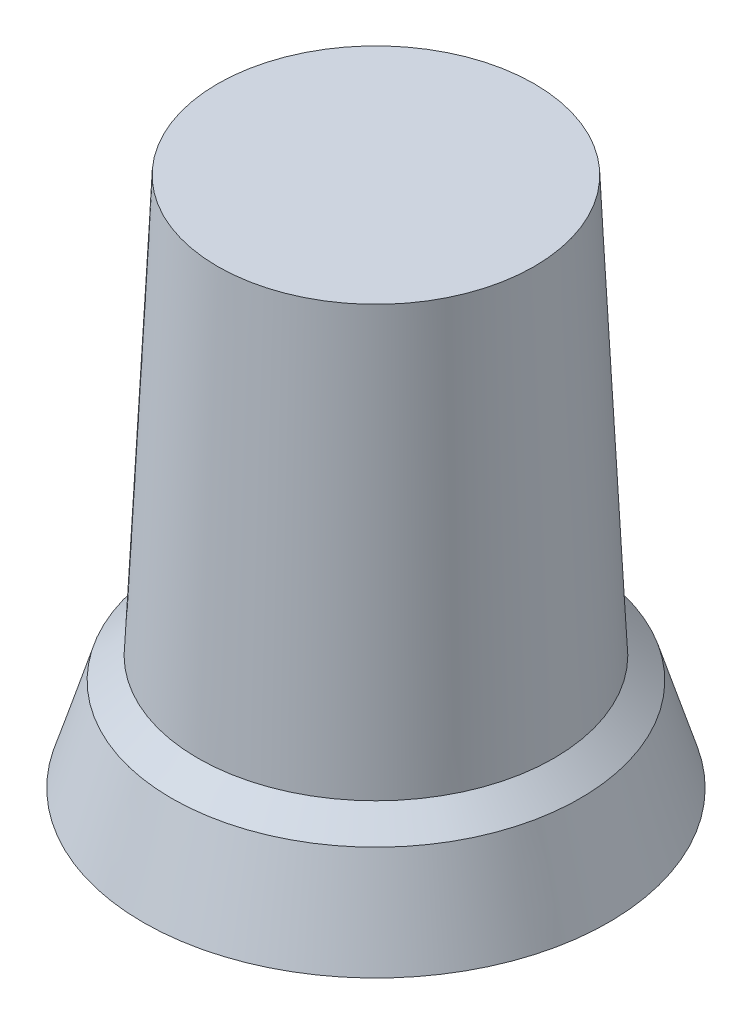
ISO-10303-21;
HEADER;
FILE_DESCRIPTION(('STEP AP214'),'2;1');
FILE_NAME('part.step','',(''),(''),'','','');
FILE_SCHEMA(('AUTOMOTIVE_DESIGN { 1 0 10303 214 1 1 1 1 }'));
ENDSEC;
DATA;
#1=APPLICATION_CONTEXT('core data for automotive mechanical design processes');
#2=APPLICATION_PROTOCOL_DEFINITION('international standard','automotive_design',2000,#1);
#3=PRODUCT_CONTEXT('',#1,'mechanical');
#4=PRODUCT('Part','Part','',(#3));
#5=PRODUCT_RELATED_PRODUCT_CATEGORY('part','',(#4));
#6=PRODUCT_DEFINITION_FORMATION('','',#4);
#7=PRODUCT_DEFINITION_CONTEXT('part definition',#1,'design');
#8=PRODUCT_DEFINITION('design','',#6,#7);
#9=PRODUCT_DEFINITION_SHAPE('','',#8);
#10=(LENGTH_UNIT() NAMED_UNIT(*) SI_UNIT(.MILLI.,.METRE.));
#11=(NAMED_UNIT(*) PLANE_ANGLE_UNIT() SI_UNIT($,.RADIAN.));
#12=(NAMED_UNIT(*) SI_UNIT($,.STERADIAN.) SOLID_ANGLE_UNIT());
#13=UNCERTAINTY_MEASURE_WITH_UNIT(LENGTH_MEASURE(1.E-05),#10,'distance_accuracy_value','');
#14=(GEOMETRIC_REPRESENTATION_CONTEXT(3) GLOBAL_UNCERTAINTY_ASSIGNED_CONTEXT((#13)) GLOBAL_UNIT_ASSIGNED_CONTEXT((#10,
#11,#12)) REPRESENTATION_CONTEXT('',''));
#15=CARTESIAN_POINT('',(0.,0.,0.));
#16=DIRECTION('',(0.,0.,1.));
#17=DIRECTION('',(1.,0.,0.));
#18=AXIS2_PLACEMENT_3D('',#15,#16,#17);
#19=CARTESIAN_POINT('',(0.,-8.38727725909835,0.));
#20=DIRECTION('',(0.,1.,0.));
#21=DIRECTION('',(0.,0.,1.));
#22=AXIS2_PLACEMENT_3D('',#19,#20,#21);
#23=CONICAL_SURFACE('',#22,6.83072698757219,1.27340551253659);
#24=CARTESIAN_POINT('',(0.,-8.18215867184745,0.));
#25=DIRECTION('',(0.,1.,0.));
#26=DIRECTION('',(0.,0.,1.));
#27=AXIS2_PLACEMENT_3D('',#24,#25,#26);
#28=CIRCLE('',#27,7.5);
#29=CARTESIAN_POINT('',(0.,-8.18215867184745,7.5));
#30=VERTEX_POINT('',#29);
#31=EDGE_CURVE('E76',#30,#30,#28,.T.);
#32=ORIENTED_EDGE('',*,*,#31,.F.);
#33=EDGE_LOOP('',(#32));
#34=FACE_BOUND('',#33,.T.);
#35=CARTESIAN_POINT('',(0.,-8.38727725909835,0.));
#36=DIRECTION('',(0.,1.,0.));
#37=DIRECTION('',(0.,0.,1.));
#38=AXIS2_PLACEMENT_3D('',#35,#36,#37);
#39=CIRCLE('',#38,6.83072698757219);
#40=CARTESIAN_POINT('',(0.,-8.38727725909835,6.83072698757219));
#41=VERTEX_POINT('',#40);
#42=EDGE_CURVE('E10',#41,#41,#39,.T.);
#43=ORIENTED_EDGE('',*,*,#42,.T.);
#44=EDGE_LOOP('',(#43));
#45=FACE_BOUND('',#44,.T.);
#46=ADVANCED_FACE('F41',(#34,#45),#23,.T.);
#47=CARTESIAN_POINT('',(0.,-5.58703224478928,0.));
#48=DIRECTION('',(0.,-1.,0.));
#49=DIRECTION('',(0.,0.,-1.));
#50=AXIS2_PLACEMENT_3D('',#47,#48,#49);
#51=CONICAL_SURFACE('',#50,5.97250875581073,0.297390814258308);
#52=ORIENTED_EDGE('',*,*,#42,.F.);
#53=EDGE_LOOP('',(#52));
#54=FACE_BOUND('',#53,.T.);
#55=CARTESIAN_POINT('',(0.,-5.58703224478928,0.));
#56=DIRECTION('',(0.,1.,0.));
#57=DIRECTION('',(0.,0.,1.));
#58=AXIS2_PLACEMENT_3D('',#55,#56,#57);
#59=CIRCLE('',#58,5.97250875581073);
#60=CARTESIAN_POINT('',(0.,-5.58703224478928,5.97250875581073));
#61=VERTEX_POINT('',#60);
#62=EDGE_CURVE('E48',#61,#61,#59,.T.);
#63=ORIENTED_EDGE('',*,*,#62,.T.);
#64=EDGE_LOOP('',(#63));
#65=FACE_BOUND('',#64,.T.);
#66=ADVANCED_FACE('F84',(#54,#65),#51,.F.);
#67=CARTESIAN_POINT('',(0.,-4.82347792026983,0.));
#68=DIRECTION('',(0.,-1.,0.));
#69=DIRECTION('',(0.,0.,-1.));
#70=AXIS2_PLACEMENT_3D('',#67,#68,#69);
#71=CONICAL_SURFACE('',#70,5.05357518031395,0.877487842459204);
#72=ORIENTED_EDGE('',*,*,#62,.F.);
#73=EDGE_LOOP('',(#72));
#74=FACE_BOUND('',#73,.T.);
#75=CARTESIAN_POINT('',(0.,-4.82347792026983,0.));
#76=DIRECTION('',(0.,1.,0.));
#77=DIRECTION('',(0.,0.,1.));
#78=AXIS2_PLACEMENT_3D('',#75,#76,#77);
#79=CIRCLE('',#78,5.05357518031395);
#80=CARTESIAN_POINT('',(0.,-4.82347792026983,5.05357518031395));
#81=VERTEX_POINT('',#80);
#82=EDGE_CURVE('E53',#81,#81,#79,.T.);
#83=ORIENTED_EDGE('',*,*,#82,.T.);
#84=EDGE_LOOP('',(#83));
#85=FACE_BOUND('',#84,.T.);
#86=ADVANCED_FACE('F88',(#74,#85),#71,.F.);
#87=CARTESIAN_POINT('',(0.,8.21784132815255,0.));
#88=DIRECTION('',(0.,-1.,0.));
#89=DIRECTION('',(0.,0.,-1.));
#90=AXIS2_PLACEMENT_3D('',#87,#88,#89);
#91=CONICAL_SURFACE('',#90,4.43254109717949,0.0475845477712229);
#92=ORIENTED_EDGE('',*,*,#82,.F.);
#93=EDGE_LOOP('',(#92));
#94=FACE_BOUND('',#93,.T.);
#95=CARTESIAN_POINT('',(0.,8.21784132815255,0.));
#96=DIRECTION('',(0.,1.,0.));
#97=DIRECTION('',(0.,0.,1.));
#98=AXIS2_PLACEMENT_3D('',#95,#96,#97);
#99=CIRCLE('',#98,4.43254109717949);
#100=CARTESIAN_POINT('',(0.,8.21784132815255,4.43254109717949));
#101=VERTEX_POINT('',#100);
#102=EDGE_CURVE('E58',#101,#101,#99,.T.);
#103=ORIENTED_EDGE('',*,*,#102,.T.);
#104=EDGE_LOOP('',(#103));
#105=FACE_BOUND('',#104,.T.);
#106=ADVANCED_FACE('F93',(#94,#105),#91,.F.);
#107=CARTESIAN_POINT('',(4.43254109717949,8.21784132815255,0.));
#108=DIRECTION('',(0.,1.,0.));
#109=DIRECTION('',(0.,0.,1.));
#110=AXIS2_PLACEMENT_3D('',#107,#108,#109);
#111=PLANE('',#110);
#112=ORIENTED_EDGE('',*,*,#102,.F.);
#113=EDGE_LOOP('',(#112));
#114=FACE_BOUND('',#113,.T.);
#115=ADVANCED_FACE('F99',(#114),#111,.F.);
#116=CARTESIAN_POINT('',(5.1,8.91784132815255,0.));
#117=DIRECTION('',(0.,-1.,0.));
#118=DIRECTION('',(0.,0.,-1.));
#119=AXIS2_PLACEMENT_3D('',#116,#117,#118);
#120=PLANE('',#119);
#121=CARTESIAN_POINT('',(0.,8.91784132815256,0.));
#122=DIRECTION('',(0.,1.,0.));
#123=DIRECTION('',(0.,0.,1.));
#124=AXIS2_PLACEMENT_3D('',#121,#122,#123);
#125=CIRCLE('',#124,5.1);
#126=CARTESIAN_POINT('',(0.,8.91784132815256,5.1));
#127=VERTEX_POINT('',#126);
#128=EDGE_CURVE('E64',#127,#127,#125,.T.);
#129=ORIENTED_EDGE('',*,*,#128,.T.);
#130=EDGE_LOOP('',(#129));
#131=FACE_BOUND('',#130,.T.);
#132=ADVANCED_FACE('F103',(#131),#120,.F.);
#133=CARTESIAN_POINT('',(0.,-4.48215867184745,0.));
#134=DIRECTION('',(0.,-1.,0.));
#135=DIRECTION('',(0.,0.,-1.));
#136=AXIS2_PLACEMENT_3D('',#133,#134,#135);
#137=CONICAL_SURFACE('',#136,5.73811463821104,0.0475845477712228);
#138=ORIENTED_EDGE('',*,*,#128,.F.);
#139=EDGE_LOOP('',(#138));
#140=FACE_BOUND('',#139,.T.);
#141=CARTESIAN_POINT('',(0.,-4.48215867184745,0.));
#142=DIRECTION('',(0.,1.,0.));
#143=DIRECTION('',(0.,0.,1.));
#144=AXIS2_PLACEMENT_3D('',#141,#142,#143);
#145=CIRCLE('',#144,5.73811463821104);
#146=CARTESIAN_POINT('',(0.,-4.48215867184745,5.73811463821104));
#147=VERTEX_POINT('',#146);
#148=EDGE_CURVE('E68',#147,#147,#145,.T.);
#149=ORIENTED_EDGE('',*,*,#148,.T.);
#150=EDGE_LOOP('',(#149));
#151=FACE_BOUND('',#150,.T.);
#152=ADVANCED_FACE('F107',(#140,#151),#137,.T.);
#153=CARTESIAN_POINT('',(0.,-5.18215867184744,0.));
#154=DIRECTION('',(0.,-1.,0.));
#155=DIRECTION('',(0.,0.,-1.));
#156=AXIS2_PLACEMENT_3D('',#153,#154,#155);
#157=CONICAL_SURFACE('',#156,6.58056092158791,0.877487842459207);
#158=ORIENTED_EDGE('',*,*,#148,.F.);
#159=EDGE_LOOP('',(#158));
#160=FACE_BOUND('',#159,.T.);
#161=CARTESIAN_POINT('',(0.,-5.18215867184744,0.));
#162=DIRECTION('',(0.,1.,0.));
#163=DIRECTION('',(0.,0.,1.));
#164=AXIS2_PLACEMENT_3D('',#161,#162,#163);
#165=CIRCLE('',#164,6.58056092158791);
#166=CARTESIAN_POINT('',(0.,-5.18215867184744,6.58056092158791));
#167=VERTEX_POINT('',#166);
#168=EDGE_CURVE('E72',#167,#167,#165,.T.);
#169=ORIENTED_EDGE('',*,*,#168,.T.);
#170=EDGE_LOOP('',(#169));
#171=FACE_BOUND('',#170,.T.);
#172=ADVANCED_FACE('F111',(#160,#171),#157,.T.);
#173=CARTESIAN_POINT('',(0.,-8.18215867184745,0.));
#174=DIRECTION('',(0.,-1.,0.));
#175=DIRECTION('',(0.,0.,-1.));
#176=AXIS2_PLACEMENT_3D('',#173,#174,#175);
#177=CONICAL_SURFACE('',#176,7.5,0.297390814258307);
#178=ORIENTED_EDGE('',*,*,#168,.F.);
#179=EDGE_LOOP('',(#178));
#180=FACE_BOUND('',#179,.T.);
#181=ORIENTED_EDGE('',*,*,#31,.T.);
#182=EDGE_LOOP('',(#181));
#183=FACE_BOUND('',#182,.T.);
#184=ADVANCED_FACE('F81',(#180,#183),#177,.T.);
#185=CLOSED_SHELL('',(#46,#66,#86,#106,#115,#132,#152,#172,#184));
#186=MANIFOLD_SOLID_BREP('B2',#185);
#187=ADVANCED_BREP_SHAPE_REPRESENTATION('',(#18,#186),#14);
#188=SHAPE_DEFINITION_REPRESENTATION(#9,#187);
ENDSEC;
END-ISO-10303-21;
